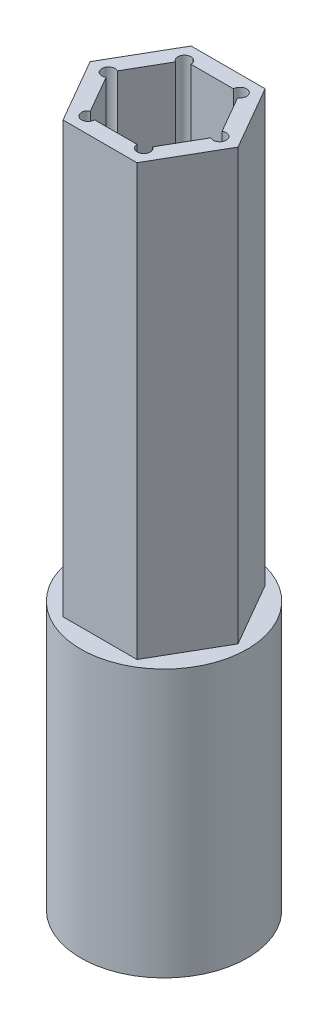
ISO-10303-21;
HEADER;
FILE_DESCRIPTION(('STEP AP214'),'2;1');
FILE_NAME('part.step','',(''),(''),'','','');
FILE_SCHEMA(('AUTOMOTIVE_DESIGN { 1 0 10303 214 1 1 1 1 }'));
ENDSEC;
DATA;
#1=APPLICATION_CONTEXT('core data for automotive mechanical design processes');
#2=APPLICATION_PROTOCOL_DEFINITION('international standard','automotive_design',2000,#1);
#3=PRODUCT_CONTEXT('',#1,'mechanical');
#4=PRODUCT('Part','Part','',(#3));
#5=PRODUCT_RELATED_PRODUCT_CATEGORY('part','',(#4));
#6=PRODUCT_DEFINITION_FORMATION('','',#4);
#7=PRODUCT_DEFINITION_CONTEXT('part definition',#1,'design');
#8=PRODUCT_DEFINITION('design','',#6,#7);
#9=PRODUCT_DEFINITION_SHAPE('','',#8);
#10=(LENGTH_UNIT() NAMED_UNIT(*) SI_UNIT(.MILLI.,.METRE.));
#11=(NAMED_UNIT(*) PLANE_ANGLE_UNIT() SI_UNIT($,.RADIAN.));
#12=(NAMED_UNIT(*) SI_UNIT($,.STERADIAN.) SOLID_ANGLE_UNIT());
#13=UNCERTAINTY_MEASURE_WITH_UNIT(LENGTH_MEASURE(1.E-05),#10,'distance_accuracy_value','');
#14=(GEOMETRIC_REPRESENTATION_CONTEXT(3) GLOBAL_UNCERTAINTY_ASSIGNED_CONTEXT((#13)) GLOBAL_UNIT_ASSIGNED_CONTEXT((#10,
#11,#12)) REPRESENTATION_CONTEXT('',''));
#15=CARTESIAN_POINT('',(0.,0.,0.));
#16=DIRECTION('',(0.,0.,1.));
#17=DIRECTION('',(1.,0.,0.));
#18=AXIS2_PLACEMENT_3D('',#15,#16,#17);
#19=CARTESIAN_POINT('',(0.,23.,0.));
#20=DIRECTION('',(0.,1.,0.));
#21=DIRECTION('',(0.,0.,1.));
#22=AXIS2_PLACEMENT_3D('',#19,#20,#21);
#23=PLANE('',#22);
#24=CARTESIAN_POINT('',(-1.48667694316326,23.,-2.57500000000002));
#25=DIRECTION('',(0.,1.,0.));
#26=DIRECTION('',(0.,0.,1.));
#27=AXIS2_PLACEMENT_3D('',#24,#25,#26);
#28=CIRCLE('',#27,0.35);
#29=CARTESIAN_POINT('',(-1.13667694316326,23.,-2.575));
#30=VERTEX_POINT('',#29);
#31=CARTESIAN_POINT('',(-1.66167694316327,23.,-2.27189110867547));
#32=VERTEX_POINT('',#31);
#33=EDGE_CURVE('E344',#30,#32,#28,.T.);
#34=ORIENTED_EDGE('',*,*,#33,.F.);
#35=DIRECTION('',(-1.,0.,0.));
#36=VECTOR('',#35,1.);
#37=CARTESIAN_POINT('',(1.48667694316329,23.,-2.575));
#38=LINE('',#37,#36);
#39=CARTESIAN_POINT('',(1.13667694316329,23.,-2.575));
#40=VERTEX_POINT('',#39);
#41=EDGE_CURVE('E222',#40,#30,#38,.T.);
#42=ORIENTED_EDGE('',*,*,#41,.F.);
#43=CARTESIAN_POINT('',(1.48667694316329,23.,-2.575));
#44=DIRECTION('',(0.,1.,0.));
#45=DIRECTION('',(0.,0.,1.));
#46=AXIS2_PLACEMENT_3D('',#43,#44,#45);
#47=CIRCLE('',#46,0.35);
#48=CARTESIAN_POINT('',(1.66167694316329,23.,-2.27189110867545));
#49=VERTEX_POINT('',#48);
#50=EDGE_CURVE('E189',#49,#40,#47,.T.);
#51=ORIENTED_EDGE('',*,*,#50,.F.);
#52=DIRECTION('',(-0.5,0.,-0.866025403784439));
#53=VECTOR('',#52,1.);
#54=CARTESIAN_POINT('',(2.97335388632657,23.,0.));
#55=LINE('',#54,#53);
#56=CARTESIAN_POINT('',(2.79835388632658,23.,-0.303108891324549));
#57=VERTEX_POINT('',#56);
#58=EDGE_CURVE('E186',#57,#49,#55,.T.);
#59=ORIENTED_EDGE('',*,*,#58,.F.);
#60=CARTESIAN_POINT('',(2.97335388632657,23.,0.));
#61=DIRECTION('',(0.,1.,0.));
#62=DIRECTION('',(0.,0.,1.));
#63=AXIS2_PLACEMENT_3D('',#60,#61,#62);
#64=CIRCLE('',#63,0.35);
#65=CARTESIAN_POINT('',(2.79835388632657,23.,0.303108891324558));
#66=VERTEX_POINT('',#65);
#67=EDGE_CURVE('E373',#66,#57,#64,.T.);
#68=ORIENTED_EDGE('',*,*,#67,.F.);
#69=DIRECTION('',(0.5,0.,-0.866025403784439));
#70=VECTOR('',#69,1.);
#71=CARTESIAN_POINT('',(1.48667694316329,23.,2.575));
#72=LINE('',#71,#70);
#73=CARTESIAN_POINT('',(1.66167694316328,23.,2.27189110867546));
#74=VERTEX_POINT('',#73);
#75=EDGE_CURVE('E213',#74,#66,#72,.T.);
#76=ORIENTED_EDGE('',*,*,#75,.F.);
#77=CARTESIAN_POINT('',(1.48667694316327,23.,2.57500000000001));
#78=DIRECTION('',(0.,1.,0.));
#79=DIRECTION('',(0.,0.,1.));
#80=AXIS2_PLACEMENT_3D('',#77,#78,#79);
#81=CIRCLE('',#80,0.35);
#82=CARTESIAN_POINT('',(1.13667694316327,23.,2.575));
#83=VERTEX_POINT('',#82);
#84=EDGE_CURVE('E364',#83,#74,#81,.T.);
#85=ORIENTED_EDGE('',*,*,#84,.F.);
#86=DIRECTION('',(1.,0.,0.));
#87=VECTOR('',#86,1.);
#88=CARTESIAN_POINT('',(-1.48667694316329,23.,2.575));
#89=LINE('',#88,#87);
#90=CARTESIAN_POINT('',(-1.1366769431633,23.,2.575));
#91=VERTEX_POINT('',#90);
#92=EDGE_CURVE('E234',#91,#83,#89,.T.);
#93=ORIENTED_EDGE('',*,*,#92,.F.);
#94=CARTESIAN_POINT('',(-1.4866769431633,23.,2.57499999999999));
#95=DIRECTION('',(0.,1.,0.));
#96=DIRECTION('',(0.,0.,1.));
#97=AXIS2_PLACEMENT_3D('',#94,#95,#96);
#98=CIRCLE('',#97,0.35);
#99=CARTESIAN_POINT('',(-1.6616769431633,23.,2.27189110867543));
#100=VERTEX_POINT('',#99);
#101=EDGE_CURVE('E329',#100,#91,#98,.T.);
#102=ORIENTED_EDGE('',*,*,#101,.F.);
#103=DIRECTION('',(0.5,0.,0.866025403784438));
#104=VECTOR('',#103,1.);
#105=CARTESIAN_POINT('',(-2.97335388632657,23.,0.));
#106=LINE('',#105,#104);
#107=CARTESIAN_POINT('',(-2.79835388632659,23.,0.303108891324534));
#108=VERTEX_POINT('',#107);
#109=EDGE_CURVE('E230',#108,#100,#106,.T.);
#110=ORIENTED_EDGE('',*,*,#109,.F.);
#111=CARTESIAN_POINT('',(-2.97335388632657,23.,0.));
#112=DIRECTION('',(0.,1.,0.));
#113=DIRECTION('',(0.,0.,1.));
#114=AXIS2_PLACEMENT_3D('',#111,#112,#113);
#115=CIRCLE('',#114,0.35);
#116=CARTESIAN_POINT('',(-2.79835388632656,23.,-0.303108891324574));
#117=VERTEX_POINT('',#116);
#118=EDGE_CURVE('E352',#117,#108,#115,.T.);
#119=ORIENTED_EDGE('',*,*,#118,.F.);
#120=DIRECTION('',(-0.5,0.,0.866025403784439));
#121=VECTOR('',#120,1.);
#122=CARTESIAN_POINT('',(-1.48667694316329,23.,-2.575));
#123=LINE('',#122,#121);
#124=EDGE_CURVE('E226',#32,#117,#123,.T.);
#125=ORIENTED_EDGE('',*,*,#124,.F.);
#126=EDGE_LOOP('',(#34,#42,#51,#59,#68,#76,#85,#93,#102,#110,#119,#125));
#127=FACE_BOUND('',#126,.T.);
#128=DIRECTION('',(-0.5,0.,-0.866025403784438));
#129=VECTOR('',#128,1.);
#130=CARTESIAN_POINT('',(3.95484934394894,23.,0.));
#131=LINE('',#130,#129);
#132=CARTESIAN_POINT('',(3.95484934394894,23.,0.));
#133=VERTEX_POINT('',#132);
#134=CARTESIAN_POINT('',(1.97742467197447,23.,-3.425));
#135=VERTEX_POINT('',#134);
#136=EDGE_CURVE('E239',#133,#135,#131,.T.);
#137=ORIENTED_EDGE('',*,*,#136,.T.);
#138=DIRECTION('',(-1.,0.,0.));
#139=VECTOR('',#138,1.);
#140=CARTESIAN_POINT('',(1.97742467197447,23.,-3.425));
#141=LINE('',#140,#139);
#142=CARTESIAN_POINT('',(-1.97742467197447,23.,-3.425));
#143=VERTEX_POINT('',#142);
#144=EDGE_CURVE('E243',#135,#143,#141,.T.);
#145=ORIENTED_EDGE('',*,*,#144,.T.);
#146=DIRECTION('',(-0.5,0.,0.866025403784439));
#147=VECTOR('',#146,1.);
#148=CARTESIAN_POINT('',(-1.97742467197447,23.,-3.425));
#149=LINE('',#148,#147);
#150=CARTESIAN_POINT('',(-3.95484934394894,23.,0.));
#151=VERTEX_POINT('',#150);
#152=EDGE_CURVE('E247',#143,#151,#149,.T.);
#153=ORIENTED_EDGE('',*,*,#152,.T.);
#154=DIRECTION('',(0.5,0.,0.866025403784438));
#155=VECTOR('',#154,1.);
#156=CARTESIAN_POINT('',(-3.95484934394894,23.,0.));
#157=LINE('',#156,#155);
#158=CARTESIAN_POINT('',(-1.97742467197447,23.,3.425));
#159=VERTEX_POINT('',#158);
#160=EDGE_CURVE('E250',#151,#159,#157,.T.);
#161=ORIENTED_EDGE('',*,*,#160,.T.);
#162=DIRECTION('',(1.,0.,0.));
#163=VECTOR('',#162,1.);
#164=CARTESIAN_POINT('',(-1.97742467197447,23.,3.425));
#165=LINE('',#164,#163);
#166=CARTESIAN_POINT('',(1.97742467197447,23.,3.425));
#167=VERTEX_POINT('',#166);
#168=EDGE_CURVE('E253',#159,#167,#165,.T.);
#169=ORIENTED_EDGE('',*,*,#168,.T.);
#170=DIRECTION('',(0.5,0.,-0.866025403784439));
#171=VECTOR('',#170,1.);
#172=CARTESIAN_POINT('',(1.97742467197447,23.,3.425));
#173=LINE('',#172,#171);
#174=EDGE_CURVE('E256',#167,#133,#173,.T.);
#175=ORIENTED_EDGE('',*,*,#174,.T.);
#176=EDGE_LOOP('',(#137,#145,#153,#161,#169,#175));
#177=FACE_BOUND('',#176,.T.);
#178=ADVANCED_FACE('F45',(#127,#177),#23,.T.);
#179=CARTESIAN_POINT('',(3.95484934394894,23.,0.));
#180=DIRECTION('',(-0.866025403784439,0.,0.5));
#181=DIRECTION('',(0.5,0.,0.866025403784439));
#182=AXIS2_PLACEMENT_3D('',#179,#180,#181);
#183=PLANE('',#182);
#184=DIRECTION('',(-0.5,0.,-0.866025403784438));
#185=VECTOR('',#184,1.);
#186=CARTESIAN_POINT('',(3.95484934394894,0.,0.));
#187=LINE('',#186,#185);
#188=CARTESIAN_POINT('',(3.95484934394894,0.,0.));
#189=VERTEX_POINT('',#188);
#190=CARTESIAN_POINT('',(1.97742467197447,0.,-3.425));
#191=VERTEX_POINT('',#190);
#192=EDGE_CURVE('E238',#189,#191,#187,.T.);
#193=ORIENTED_EDGE('',*,*,#192,.T.);
#194=DIRECTION('',(0.,-1.,0.));
#195=VECTOR('',#194,1.);
#196=CARTESIAN_POINT('',(1.97742467197447,23.,-3.425));
#197=LINE('',#196,#195);
#198=EDGE_CURVE('E301',#135,#191,#197,.T.);
#199=ORIENTED_EDGE('',*,*,#198,.F.);
#200=ORIENTED_EDGE('',*,*,#136,.F.);
#201=DIRECTION('',(0.,-1.,0.));
#202=VECTOR('',#201,1.);
#203=CARTESIAN_POINT('',(3.95484934394894,23.,0.));
#204=LINE('',#203,#202);
#205=EDGE_CURVE('E259',#133,#189,#204,.T.);
#206=ORIENTED_EDGE('',*,*,#205,.T.);
#207=EDGE_LOOP('',(#193,#199,#200,#206));
#208=FACE_BOUND('',#207,.T.);
#209=ADVANCED_FACE('F47',(#208),#183,.F.);
#210=CARTESIAN_POINT('',(1.97742467197447,23.,-3.425));
#211=DIRECTION('',(0.,0.,1.));
#212=DIRECTION('',(1.,0.,0.));
#213=AXIS2_PLACEMENT_3D('',#210,#211,#212);
#214=PLANE('',#213);
#215=DIRECTION('',(-1.,0.,0.));
#216=VECTOR('',#215,1.);
#217=CARTESIAN_POINT('',(1.97742467197447,0.,-3.425));
#218=LINE('',#217,#216);
#219=CARTESIAN_POINT('',(-1.97742467197447,0.,-3.425));
#220=VERTEX_POINT('',#219);
#221=EDGE_CURVE('E263',#191,#220,#218,.T.);
#222=ORIENTED_EDGE('',*,*,#221,.T.);
#223=DIRECTION('',(0.,-1.,0.));
#224=VECTOR('',#223,1.);
#225=CARTESIAN_POINT('',(-1.97742467197447,23.,-3.425));
#226=LINE('',#225,#224);
#227=EDGE_CURVE('E297',#143,#220,#226,.T.);
#228=ORIENTED_EDGE('',*,*,#227,.F.);
#229=ORIENTED_EDGE('',*,*,#144,.F.);
#230=ORIENTED_EDGE('',*,*,#198,.T.);
#231=EDGE_LOOP('',(#222,#228,#229,#230));
#232=FACE_BOUND('',#231,.T.);
#233=ADVANCED_FACE('F427',(#232),#214,.F.);
#234=CARTESIAN_POINT('',(-1.97742467197447,23.,-3.425));
#235=DIRECTION('',(0.866025403784439,0.,0.5));
#236=DIRECTION('',(0.5,0.,-0.866025403784439));
#237=AXIS2_PLACEMENT_3D('',#234,#235,#236);
#238=PLANE('',#237);
#239=DIRECTION('',(-0.5,0.,0.866025403784439));
#240=VECTOR('',#239,1.);
#241=CARTESIAN_POINT('',(-1.97742467197447,0.,-3.425));
#242=LINE('',#241,#240);
#243=CARTESIAN_POINT('',(-3.95484934394894,0.,0.));
#244=VERTEX_POINT('',#243);
#245=EDGE_CURVE('E267',#220,#244,#242,.T.);
#246=ORIENTED_EDGE('',*,*,#245,.T.);
#247=DIRECTION('',(0.,-1.,0.));
#248=VECTOR('',#247,1.);
#249=CARTESIAN_POINT('',(-3.95484934394894,23.,0.));
#250=LINE('',#249,#248);
#251=EDGE_CURVE('E293',#151,#244,#250,.T.);
#252=ORIENTED_EDGE('',*,*,#251,.F.);
#253=ORIENTED_EDGE('',*,*,#152,.F.);
#254=ORIENTED_EDGE('',*,*,#227,.T.);
#255=EDGE_LOOP('',(#246,#252,#253,#254));
#256=FACE_BOUND('',#255,.T.);
#257=ADVANCED_FACE('F443',(#256),#238,.F.);
#258=CARTESIAN_POINT('',(-3.95484934394894,23.,0.));
#259=DIRECTION('',(0.866025403784438,0.,-0.5));
#260=DIRECTION('',(-0.5,0.,-0.866025403784438));
#261=AXIS2_PLACEMENT_3D('',#258,#259,#260);
#262=PLANE('',#261);
#263=DIRECTION('',(0.5,0.,0.866025403784438));
#264=VECTOR('',#263,1.);
#265=CARTESIAN_POINT('',(-3.95484934394894,0.,0.));
#266=LINE('',#265,#264);
#267=CARTESIAN_POINT('',(-1.97742467197447,0.,3.425));
#268=VERTEX_POINT('',#267);
#269=EDGE_CURVE('E271',#244,#268,#266,.T.);
#270=ORIENTED_EDGE('',*,*,#269,.T.);
#271=DIRECTION('',(0.,-1.,0.));
#272=VECTOR('',#271,1.);
#273=CARTESIAN_POINT('',(-1.97742467197447,23.,3.425));
#274=LINE('',#273,#272);
#275=EDGE_CURVE('E289',#159,#268,#274,.T.);
#276=ORIENTED_EDGE('',*,*,#275,.F.);
#277=ORIENTED_EDGE('',*,*,#160,.F.);
#278=ORIENTED_EDGE('',*,*,#251,.T.);
#279=EDGE_LOOP('',(#270,#276,#277,#278));
#280=FACE_BOUND('',#279,.T.);
#281=ADVANCED_FACE('F439',(#280),#262,.F.);
#282=CARTESIAN_POINT('',(-1.97742467197447,23.,3.425));
#283=DIRECTION('',(0.,0.,-1.));
#284=DIRECTION('',(-1.,0.,0.));
#285=AXIS2_PLACEMENT_3D('',#282,#283,#284);
#286=PLANE('',#285);
#287=DIRECTION('',(1.,0.,0.));
#288=VECTOR('',#287,1.);
#289=CARTESIAN_POINT('',(-1.97742467197447,0.,3.425));
#290=LINE('',#289,#288);
#291=CARTESIAN_POINT('',(1.97742467197447,0.,3.425));
#292=VERTEX_POINT('',#291);
#293=EDGE_CURVE('E275',#268,#292,#290,.T.);
#294=ORIENTED_EDGE('',*,*,#293,.T.);
#295=DIRECTION('',(0.,-1.,0.));
#296=VECTOR('',#295,1.);
#297=CARTESIAN_POINT('',(1.97742467197447,23.,3.425));
#298=LINE('',#297,#296);
#299=EDGE_CURVE('E285',#167,#292,#298,.T.);
#300=ORIENTED_EDGE('',*,*,#299,.F.);
#301=ORIENTED_EDGE('',*,*,#168,.F.);
#302=ORIENTED_EDGE('',*,*,#275,.T.);
#303=EDGE_LOOP('',(#294,#300,#301,#302));
#304=FACE_BOUND('',#303,.T.);
#305=ADVANCED_FACE('F435',(#304),#286,.F.);
#306=CARTESIAN_POINT('',(1.97742467197447,23.,3.425));
#307=DIRECTION('',(-0.866025403784439,0.,-0.5));
#308=DIRECTION('',(-0.5,0.,0.866025403784439));
#309=AXIS2_PLACEMENT_3D('',#306,#307,#308);
#310=PLANE('',#309);
#311=DIRECTION('',(0.5,0.,-0.866025403784439));
#312=VECTOR('',#311,1.);
#313=CARTESIAN_POINT('',(1.97742467197447,0.,3.425));
#314=LINE('',#313,#312);
#315=EDGE_CURVE('E244',#292,#189,#314,.T.);
#316=ORIENTED_EDGE('',*,*,#315,.T.);
#317=ORIENTED_EDGE('',*,*,#205,.F.);
#318=ORIENTED_EDGE('',*,*,#174,.F.);
#319=ORIENTED_EDGE('',*,*,#299,.T.);
#320=EDGE_LOOP('',(#316,#317,#318,#319));
#321=FACE_BOUND('',#320,.T.);
#322=ADVANCED_FACE('F432',(#321),#310,.F.);
#323=CARTESIAN_POINT('',(1.48667694316329,23.,2.575));
#324=DIRECTION('',(-0.866025403784439,0.,-0.499999999999999));
#325=DIRECTION('',(-0.5,0.,0.866025403784439));
#326=AXIS2_PLACEMENT_3D('',#323,#324,#325);
#327=PLANE('',#326);
#328=DIRECTION('',(0.,1.,0.));
#329=VECTOR('',#328,1.);
#330=CARTESIAN_POINT('',(1.66167694316328,-14.3,2.27189110867546));
#331=LINE('',#330,#329);
#332=CARTESIAN_POINT('',(1.66167694316328,-14.3,2.27189110867546));
#333=VERTEX_POINT('',#332);
#334=EDGE_CURVE('E361',#74,#333,#331,.F.);
#335=ORIENTED_EDGE('',*,*,#334,.F.);
#336=ORIENTED_EDGE('',*,*,#75,.T.);
#337=DIRECTION('',(0.,1.,0.));
#338=VECTOR('',#337,1.);
#339=CARTESIAN_POINT('',(2.79835388632657,-14.3,0.303108891324558));
#340=LINE('',#339,#338);
#341=CARTESIAN_POINT('',(2.79835388632657,-14.3,0.303108891324558));
#342=VERTEX_POINT('',#341);
#343=EDGE_CURVE('E370',#342,#66,#340,.T.);
#344=ORIENTED_EDGE('',*,*,#343,.F.);
#345=DIRECTION('',(-0.5,0.,0.866025403784439));
#346=VECTOR('',#345,1.);
#347=CARTESIAN_POINT('',(2.97335388632657,-14.3,0.));
#348=LINE('',#347,#346);
#349=EDGE_CURVE('E197',#342,#333,#348,.T.);
#350=ORIENTED_EDGE('',*,*,#349,.T.);
#351=EDGE_LOOP('',(#335,#336,#344,#350));
#352=FACE_BOUND('',#351,.T.);
#353=ADVANCED_FACE('F404',(#352),#327,.T.);
#354=CARTESIAN_POINT('',(2.97335388632657,23.,0.));
#355=DIRECTION('',(-0.866025403784438,0.,0.5));
#356=DIRECTION('',(0.5,0.,0.866025403784439));
#357=AXIS2_PLACEMENT_3D('',#354,#355,#356);
#358=PLANE('',#357);
#359=DIRECTION('',(0.,1.,0.));
#360=VECTOR('',#359,1.);
#361=CARTESIAN_POINT('',(2.79835388632658,-14.3,-0.303108891324549));
#362=LINE('',#361,#360);
#363=CARTESIAN_POINT('',(2.79835388632658,-14.3,-0.303108891324549));
#364=VERTEX_POINT('',#363);
#365=EDGE_CURVE('E188',#57,#364,#362,.F.);
#366=ORIENTED_EDGE('',*,*,#365,.F.);
#367=ORIENTED_EDGE('',*,*,#58,.T.);
#368=DIRECTION('',(0.,1.,0.));
#369=VECTOR('',#368,1.);
#370=CARTESIAN_POINT('',(1.66167694316329,-14.3,-2.27189110867545));
#371=LINE('',#370,#369);
#372=CARTESIAN_POINT('',(1.66167694316329,-14.3,-2.27189110867545));
#373=VERTEX_POINT('',#372);
#374=EDGE_CURVE('E170',#373,#49,#371,.T.);
#375=ORIENTED_EDGE('',*,*,#374,.F.);
#376=DIRECTION('',(0.5,0.,0.866025403784439));
#377=VECTOR('',#376,1.);
#378=CARTESIAN_POINT('',(1.48667694316329,-14.3,-2.575));
#379=LINE('',#378,#377);
#380=EDGE_CURVE('E184',#373,#364,#379,.T.);
#381=ORIENTED_EDGE('',*,*,#380,.T.);
#382=EDGE_LOOP('',(#366,#367,#375,#381));
#383=FACE_BOUND('',#382,.T.);
#384=ADVANCED_FACE('F183',(#383),#358,.T.);
#385=CARTESIAN_POINT('',(1.48667694316329,23.,-2.575));
#386=DIRECTION('',(0.,0.,1.));
#387=DIRECTION('',(1.,0.,0.));
#388=AXIS2_PLACEMENT_3D('',#385,#386,#387);
#389=PLANE('',#388);
#390=DIRECTION('',(0.,1.,0.));
#391=VECTOR('',#390,1.);
#392=CARTESIAN_POINT('',(-1.13667694316326,-14.3,-2.575));
#393=LINE('',#392,#391);
#394=CARTESIAN_POINT('',(-1.13667694316326,-14.3,-2.575));
#395=VERTEX_POINT('',#394);
#396=EDGE_CURVE('E339',#395,#30,#393,.T.);
#397=ORIENTED_EDGE('',*,*,#396,.F.);
#398=DIRECTION('',(1.,0.,0.));
#399=VECTOR('',#398,1.);
#400=CARTESIAN_POINT('',(-1.48667694316329,-14.3,-2.575));
#401=LINE('',#400,#399);
#402=CARTESIAN_POINT('',(1.13667694316329,-14.3,-2.575));
#403=VERTEX_POINT('',#402);
#404=EDGE_CURVE('E198',#395,#403,#401,.T.);
#405=ORIENTED_EDGE('',*,*,#404,.T.);
#406=DIRECTION('',(0.,1.,0.));
#407=VECTOR('',#406,1.);
#408=CARTESIAN_POINT('',(1.13667694316329,-14.3,-2.575));
#409=LINE('',#408,#407);
#410=EDGE_CURVE('E69',#40,#403,#409,.F.);
#411=ORIENTED_EDGE('',*,*,#410,.F.);
#412=ORIENTED_EDGE('',*,*,#41,.T.);
#413=EDGE_LOOP('',(#397,#405,#411,#412));
#414=FACE_BOUND('',#413,.T.);
#415=ADVANCED_FACE('F411',(#414),#389,.T.);
#416=CARTESIAN_POINT('',(-1.48667694316329,23.,-2.575));
#417=DIRECTION('',(0.866025403784439,0.,0.5));
#418=DIRECTION('',(0.5,0.,-0.866025403784439));
#419=AXIS2_PLACEMENT_3D('',#416,#417,#418);
#420=PLANE('',#419);
#421=DIRECTION('',(0.,1.,0.));
#422=VECTOR('',#421,1.);
#423=CARTESIAN_POINT('',(-1.66167694316327,-14.3,-2.27189110867547));
#424=LINE('',#423,#422);
#425=CARTESIAN_POINT('',(-1.66167694316327,-14.3,-2.27189110867547));
#426=VERTEX_POINT('',#425);
#427=EDGE_CURVE('E61',#32,#426,#424,.F.);
#428=ORIENTED_EDGE('',*,*,#427,.F.);
#429=ORIENTED_EDGE('',*,*,#124,.T.);
#430=DIRECTION('',(0.,1.,0.));
#431=VECTOR('',#430,1.);
#432=CARTESIAN_POINT('',(-2.79835388632656,-14.3,-0.303108891324574));
#433=LINE('',#432,#431);
#434=CARTESIAN_POINT('',(-2.79835388632656,-14.3,-0.303108891324574));
#435=VERTEX_POINT('',#434);
#436=EDGE_CURVE('E349',#435,#117,#433,.T.);
#437=ORIENTED_EDGE('',*,*,#436,.F.);
#438=DIRECTION('',(0.5,0.,-0.866025403784439));
#439=VECTOR('',#438,1.);
#440=CARTESIAN_POINT('',(-2.97335388632657,-14.3,0.));
#441=LINE('',#440,#439);
#442=EDGE_CURVE('E205',#435,#426,#441,.T.);
#443=ORIENTED_EDGE('',*,*,#442,.T.);
#444=EDGE_LOOP('',(#428,#429,#437,#443));
#445=FACE_BOUND('',#444,.T.);
#446=ADVANCED_FACE('F386',(#445),#420,.T.);
#447=CARTESIAN_POINT('',(-2.97335388632657,23.,0.));
#448=DIRECTION('',(0.866025403784438,0.,-0.5));
#449=DIRECTION('',(-0.5,0.,-0.866025403784438));
#450=AXIS2_PLACEMENT_3D('',#447,#448,#449);
#451=PLANE('',#450);
#452=DIRECTION('',(0.,1.,0.));
#453=VECTOR('',#452,1.);
#454=CARTESIAN_POINT('',(-2.79835388632659,-14.3,0.303108891324534));
#455=LINE('',#454,#453);
#456=CARTESIAN_POINT('',(-2.79835388632659,-14.3,0.303108891324534));
#457=VERTEX_POINT('',#456);
#458=EDGE_CURVE('E328',#108,#457,#455,.F.);
#459=ORIENTED_EDGE('',*,*,#458,.F.);
#460=ORIENTED_EDGE('',*,*,#109,.T.);
#461=DIRECTION('',(0.,1.,0.));
#462=VECTOR('',#461,1.);
#463=CARTESIAN_POINT('',(-1.6616769431633,-14.3,2.27189110867543));
#464=LINE('',#463,#462);
#465=CARTESIAN_POINT('',(-1.6616769431633,-14.3,2.27189110867543));
#466=VERTEX_POINT('',#465);
#467=EDGE_CURVE('E314',#466,#100,#464,.T.);
#468=ORIENTED_EDGE('',*,*,#467,.F.);
#469=DIRECTION('',(-0.5,0.,-0.866025403784438));
#470=VECTOR('',#469,1.);
#471=CARTESIAN_POINT('',(-1.48667694316329,-14.3,2.575));
#472=LINE('',#471,#470);
#473=EDGE_CURVE('E325',#466,#457,#472,.T.);
#474=ORIENTED_EDGE('',*,*,#473,.T.);
#475=EDGE_LOOP('',(#459,#460,#468,#474));
#476=FACE_BOUND('',#475,.T.);
#477=ADVANCED_FACE('F324',(#476),#451,.T.);
#478=CARTESIAN_POINT('',(-1.48667694316329,23.,2.575));
#479=DIRECTION('',(0.,0.,-1.));
#480=DIRECTION('',(-1.,0.,0.));
#481=AXIS2_PLACEMENT_3D('',#478,#479,#480);
#482=PLANE('',#481);
#483=DIRECTION('',(0.,1.,0.));
#484=VECTOR('',#483,1.);
#485=CARTESIAN_POINT('',(-1.1366769431633,-14.3,2.575));
#486=LINE('',#485,#484);
#487=CARTESIAN_POINT('',(-1.1366769431633,-14.3,2.575));
#488=VERTEX_POINT('',#487);
#489=EDGE_CURVE('E317',#91,#488,#486,.F.);
#490=ORIENTED_EDGE('',*,*,#489,.F.);
#491=ORIENTED_EDGE('',*,*,#92,.T.);
#492=DIRECTION('',(0.,1.,0.));
#493=VECTOR('',#492,1.);
#494=CARTESIAN_POINT('',(1.13667694316327,-14.3,2.575));
#495=LINE('',#494,#493);
#496=CARTESIAN_POINT('',(1.13667694316327,-14.3,2.575));
#497=VERTEX_POINT('',#496);
#498=EDGE_CURVE('E367',#497,#83,#495,.T.);
#499=ORIENTED_EDGE('',*,*,#498,.F.);
#500=DIRECTION('',(-1.,0.,0.));
#501=VECTOR('',#500,1.);
#502=CARTESIAN_POINT('',(1.48667694316329,-14.3,2.575));
#503=LINE('',#502,#501);
#504=EDGE_CURVE('E334',#497,#488,#503,.T.);
#505=ORIENTED_EDGE('',*,*,#504,.T.);
#506=EDGE_LOOP('',(#490,#491,#499,#505));
#507=FACE_BOUND('',#506,.T.);
#508=ADVANCED_FACE('F397',(#507),#482,.T.);
#509=CARTESIAN_POINT('',(0.,-14.3,0.));
#510=DIRECTION('',(0.,-1.,0.));
#511=DIRECTION('',(0.,0.,-1.));
#512=AXIS2_PLACEMENT_3D('',#509,#510,#511);
#513=PLANE('',#512);
#514=CARTESIAN_POINT('',(-1.48667694316326,-14.3,-2.57500000000002));
#515=DIRECTION('',(0.,1.,0.));
#516=DIRECTION('',(0.,0.,1.));
#517=AXIS2_PLACEMENT_3D('',#514,#515,#516);
#518=CIRCLE('',#517,0.35);
#519=EDGE_CURVE('E177',#395,#426,#518,.T.);
#520=ORIENTED_EDGE('',*,*,#519,.T.);
#521=ORIENTED_EDGE('',*,*,#442,.F.);
#522=CARTESIAN_POINT('',(-2.97335388632657,-14.3,0.));
#523=DIRECTION('',(0.,-1.,0.));
#524=DIRECTION('',(0.,0.,-1.));
#525=AXIS2_PLACEMENT_3D('',#522,#523,#524);
#526=CIRCLE('',#525,0.35);
#527=EDGE_CURVE('E11',#457,#435,#526,.T.);
#528=ORIENTED_EDGE('',*,*,#527,.F.);
#529=ORIENTED_EDGE('',*,*,#473,.F.);
#530=CARTESIAN_POINT('',(-1.4866769431633,-14.3,2.57499999999999));
#531=DIRECTION('',(0.,-1.,0.));
#532=DIRECTION('',(0.,0.,-1.));
#533=AXIS2_PLACEMENT_3D('',#530,#531,#532);
#534=CIRCLE('',#533,0.35);
#535=EDGE_CURVE('E54',#488,#466,#534,.T.);
#536=ORIENTED_EDGE('',*,*,#535,.F.);
#537=ORIENTED_EDGE('',*,*,#504,.F.);
#538=CARTESIAN_POINT('',(1.48667694316327,-14.3,2.57500000000001));
#539=DIRECTION('',(0.,-1.,0.));
#540=DIRECTION('',(0.,0.,-1.));
#541=AXIS2_PLACEMENT_3D('',#538,#539,#540);
#542=CIRCLE('',#541,0.35);
#543=EDGE_CURVE('E307',#333,#497,#542,.T.);
#544=ORIENTED_EDGE('',*,*,#543,.F.);
#545=ORIENTED_EDGE('',*,*,#349,.F.);
#546=CARTESIAN_POINT('',(2.97335388632657,-14.3,0.));
#547=DIRECTION('',(0.,-1.,0.));
#548=DIRECTION('',(0.,0.,-1.));
#549=AXIS2_PLACEMENT_3D('',#546,#547,#548);
#550=CIRCLE('',#549,0.35);
#551=EDGE_CURVE('E195',#364,#342,#550,.T.);
#552=ORIENTED_EDGE('',*,*,#551,.F.);
#553=ORIENTED_EDGE('',*,*,#380,.F.);
#554=CARTESIAN_POINT('',(1.48667694316329,-14.3,-2.575));
#555=DIRECTION('',(0.,1.,0.));
#556=DIRECTION('',(0.,0.,1.));
#557=AXIS2_PLACEMENT_3D('',#554,#555,#556);
#558=CIRCLE('',#557,0.35);
#559=EDGE_CURVE('E167',#373,#403,#558,.T.);
#560=ORIENTED_EDGE('',*,*,#559,.T.);
#561=ORIENTED_EDGE('',*,*,#404,.F.);
#562=EDGE_LOOP('',(#520,#521,#528,#529,#536,#537,#544,#545,#552,#553,#560,#561));
#563=FACE_BOUND('',#562,.T.);
#564=CARTESIAN_POINT('',(0.,-14.3,0.));
#565=DIRECTION('',(0.,-1.,0.));
#566=DIRECTION('',(0.,0.,-1.));
#567=AXIS2_PLACEMENT_3D('',#564,#565,#566);
#568=CIRCLE('',#567,4.45);
#569=CARTESIAN_POINT('',(0.,-14.3,-4.45));
#570=VERTEX_POINT('',#569);
#571=EDGE_CURVE('E209',#570,#570,#568,.T.);
#572=ORIENTED_EDGE('',*,*,#571,.T.);
#573=EDGE_LOOP('',(#572));
#574=FACE_BOUND('',#573,.T.);
#575=ADVANCED_FACE('F192',(#563,#574),#513,.T.);
#576=CARTESIAN_POINT('',(0.,0.,0.));
#577=DIRECTION('',(0.,-1.,0.));
#578=DIRECTION('',(0.,0.,-1.));
#579=AXIS2_PLACEMENT_3D('',#576,#577,#578);
#580=PLANE('',#579);
#581=ORIENTED_EDGE('',*,*,#192,.F.);
#582=ORIENTED_EDGE('',*,*,#315,.F.);
#583=ORIENTED_EDGE('',*,*,#293,.F.);
#584=ORIENTED_EDGE('',*,*,#269,.F.);
#585=ORIENTED_EDGE('',*,*,#245,.F.);
#586=ORIENTED_EDGE('',*,*,#221,.F.);
#587=EDGE_LOOP('',(#581,#582,#583,#584,#585,#586));
#588=FACE_BOUND('',#587,.T.);
#589=CARTESIAN_POINT('',(0.,0.,0.));
#590=DIRECTION('',(0.,-1.,0.));
#591=DIRECTION('',(0.,0.,-1.));
#592=AXIS2_PLACEMENT_3D('',#589,#590,#591);
#593=CIRCLE('',#592,4.45);
#594=CARTESIAN_POINT('',(0.,0.,-4.45));
#595=VERTEX_POINT('',#594);
#596=EDGE_CURVE('E203',#595,#595,#593,.T.);
#597=ORIENTED_EDGE('',*,*,#596,.F.);
#598=EDGE_LOOP('',(#597));
#599=FACE_BOUND('',#598,.T.);
#600=ADVANCED_FACE('F461',(#588,#599),#580,.F.);
#601=CARTESIAN_POINT('',(0.,-14.3,0.));
#602=DIRECTION('',(0.,1.,0.));
#603=DIRECTION('',(0.,0.,1.));
#604=AXIS2_PLACEMENT_3D('',#601,#602,#603);
#605=CYLINDRICAL_SURFACE('',#604,4.45);
#606=ORIENTED_EDGE('',*,*,#571,.F.);
#607=EDGE_LOOP('',(#606));
#608=FACE_BOUND('',#607,.T.);
#609=ORIENTED_EDGE('',*,*,#596,.T.);
#610=EDGE_LOOP('',(#609));
#611=FACE_BOUND('',#610,.T.);
#612=ADVANCED_FACE('F466',(#608,#611),#605,.T.);
#613=CARTESIAN_POINT('',(1.48667694316329,-14.3,-2.575));
#614=DIRECTION('',(0.,1.,0.));
#615=DIRECTION('',(0.,0.,1.));
#616=AXIS2_PLACEMENT_3D('',#613,#614,#615);
#617=CYLINDRICAL_SURFACE('',#616,0.35);
#618=ORIENTED_EDGE('',*,*,#374,.T.);
#619=ORIENTED_EDGE('',*,*,#50,.T.);
#620=ORIENTED_EDGE('',*,*,#410,.T.);
#621=ORIENTED_EDGE('',*,*,#559,.F.);
#622=EDGE_LOOP('',(#618,#619,#620,#621));
#623=FACE_BOUND('',#622,.T.);
#624=ADVANCED_FACE('F169',(#623),#617,.F.);
#625=CARTESIAN_POINT('',(2.97335388632657,-14.3,0.));
#626=DIRECTION('',(0.,1.,0.));
#627=DIRECTION('',(0.,0.,1.));
#628=AXIS2_PLACEMENT_3D('',#625,#626,#627);
#629=CYLINDRICAL_SURFACE('',#628,0.35);
#630=ORIENTED_EDGE('',*,*,#343,.T.);
#631=ORIENTED_EDGE('',*,*,#67,.T.);
#632=ORIENTED_EDGE('',*,*,#365,.T.);
#633=ORIENTED_EDGE('',*,*,#551,.T.);
#634=EDGE_LOOP('',(#630,#631,#632,#633));
#635=FACE_BOUND('',#634,.T.);
#636=ADVANCED_FACE('F408',(#635),#629,.F.);
#637=CARTESIAN_POINT('',(1.48667694316327,-14.3,2.57500000000001));
#638=DIRECTION('',(0.,1.,0.));
#639=DIRECTION('',(0.,0.,1.));
#640=AXIS2_PLACEMENT_3D('',#637,#638,#639);
#641=CYLINDRICAL_SURFACE('',#640,0.35);
#642=ORIENTED_EDGE('',*,*,#334,.T.);
#643=ORIENTED_EDGE('',*,*,#543,.T.);
#644=ORIENTED_EDGE('',*,*,#498,.T.);
#645=ORIENTED_EDGE('',*,*,#84,.T.);
#646=EDGE_LOOP('',(#642,#643,#644,#645));
#647=FACE_BOUND('',#646,.T.);
#648=ADVANCED_FACE('F564',(#647),#641,.F.);
#649=CARTESIAN_POINT('',(-1.4866769431633,-14.3,2.57499999999999));
#650=DIRECTION('',(0.,1.,0.));
#651=DIRECTION('',(0.,0.,1.));
#652=AXIS2_PLACEMENT_3D('',#649,#650,#651);
#653=CYLINDRICAL_SURFACE('',#652,0.35);
#654=ORIENTED_EDGE('',*,*,#467,.T.);
#655=ORIENTED_EDGE('',*,*,#101,.T.);
#656=ORIENTED_EDGE('',*,*,#489,.T.);
#657=ORIENTED_EDGE('',*,*,#535,.T.);
#658=EDGE_LOOP('',(#654,#655,#656,#657));
#659=FACE_BOUND('',#658,.T.);
#660=ADVANCED_FACE('F313',(#659),#653,.F.);
#661=CARTESIAN_POINT('',(-2.97335388632657,-14.3,0.));
#662=DIRECTION('',(0.,1.,0.));
#663=DIRECTION('',(0.,0.,1.));
#664=AXIS2_PLACEMENT_3D('',#661,#662,#663);
#665=CYLINDRICAL_SURFACE('',#664,0.35);
#666=ORIENTED_EDGE('',*,*,#436,.T.);
#667=ORIENTED_EDGE('',*,*,#118,.T.);
#668=ORIENTED_EDGE('',*,*,#458,.T.);
#669=ORIENTED_EDGE('',*,*,#527,.T.);
#670=EDGE_LOOP('',(#666,#667,#668,#669));
#671=FACE_BOUND('',#670,.T.);
#672=ADVANCED_FACE('F390',(#671),#665,.F.);
#673=CARTESIAN_POINT('',(-1.48667694316326,-14.3,-2.57500000000002));
#674=DIRECTION('',(0.,1.,0.));
#675=DIRECTION('',(0.,0.,1.));
#676=AXIS2_PLACEMENT_3D('',#673,#674,#675);
#677=CYLINDRICAL_SURFACE('',#676,0.35);
#678=ORIENTED_EDGE('',*,*,#396,.T.);
#679=ORIENTED_EDGE('',*,*,#33,.T.);
#680=ORIENTED_EDGE('',*,*,#427,.T.);
#681=ORIENTED_EDGE('',*,*,#519,.F.);
#682=EDGE_LOOP('',(#678,#679,#680,#681));
#683=FACE_BOUND('',#682,.T.);
#684=ADVANCED_FACE('F412',(#683),#677,.F.);
#685=CLOSED_SHELL('',(#178,#209,#233,#257,#281,#305,#322,#353,#384,#415,#446,#477,#508,#575,
#600,#612,#624,#636,#648,#660,#672,#684));
#686=MANIFOLD_SOLID_BREP('B2',#685);
#687=ADVANCED_BREP_SHAPE_REPRESENTATION('',(#18,#686),#14);
#688=SHAPE_DEFINITION_REPRESENTATION(#9,#687);
ENDSEC;
END-ISO-10303-21;
